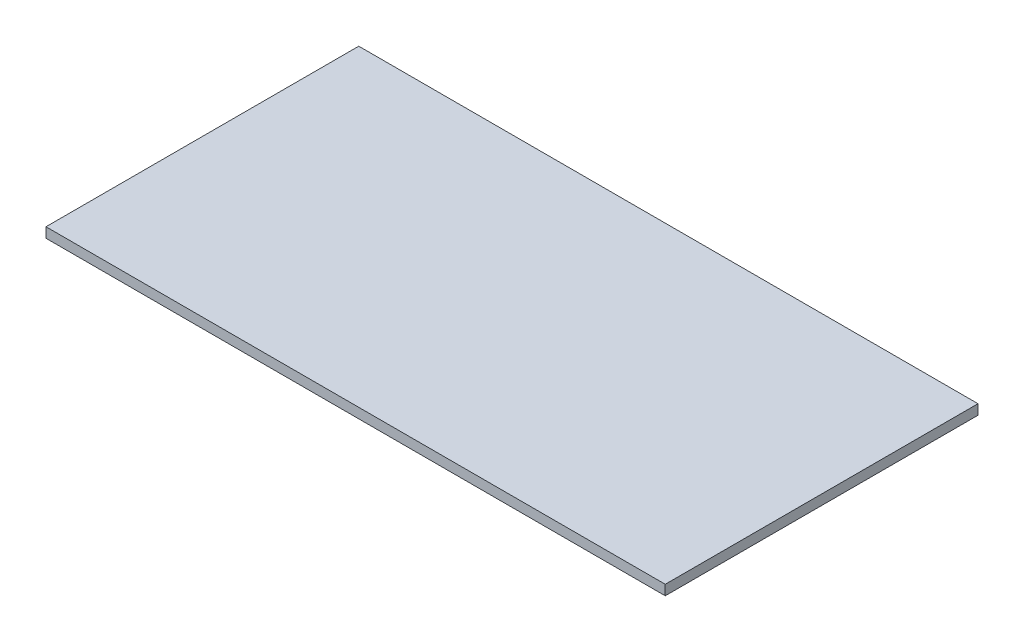
ISO-10303-21;
HEADER;
FILE_DESCRIPTION(('STEP AP214'),'2;1');
FILE_NAME('part.step','',(''),(''),'','','');
FILE_SCHEMA(('AUTOMOTIVE_DESIGN { 1 0 10303 214 1 1 1 1 }'));
ENDSEC;
DATA;
#1=APPLICATION_CONTEXT('core data for automotive mechanical design processes');
#2=APPLICATION_PROTOCOL_DEFINITION('international standard','automotive_design',2000,#1);
#3=PRODUCT_CONTEXT('',#1,'mechanical');
#4=PRODUCT('Part','Part','',(#3));
#5=PRODUCT_RELATED_PRODUCT_CATEGORY('part','',(#4));
#6=PRODUCT_DEFINITION_FORMATION('','',#4);
#7=PRODUCT_DEFINITION_CONTEXT('part definition',#1,'design');
#8=PRODUCT_DEFINITION('design','',#6,#7);
#9=PRODUCT_DEFINITION_SHAPE('','',#8);
#10=(LENGTH_UNIT() NAMED_UNIT(*) SI_UNIT(.MILLI.,.METRE.));
#11=(NAMED_UNIT(*) PLANE_ANGLE_UNIT() SI_UNIT($,.RADIAN.));
#12=(NAMED_UNIT(*) SI_UNIT($,.STERADIAN.) SOLID_ANGLE_UNIT());
#13=UNCERTAINTY_MEASURE_WITH_UNIT(LENGTH_MEASURE(1.E-05),#10,'distance_accuracy_value','');
#14=(GEOMETRIC_REPRESENTATION_CONTEXT(3) GLOBAL_UNCERTAINTY_ASSIGNED_CONTEXT((#13)) GLOBAL_UNIT_ASSIGNED_CONTEXT((#10,
#11,#12)) REPRESENTATION_CONTEXT('',''));
#15=CARTESIAN_POINT('',(0.,0.,0.));
#16=DIRECTION('',(0.,0.,1.));
#17=DIRECTION('',(1.,0.,0.));
#18=AXIS2_PLACEMENT_3D('',#15,#16,#17);
#19=CARTESIAN_POINT('',(-53.0588235294118,1.6,-16.9852941176471));
#20=DIRECTION('',(1.,0.,0.));
#21=DIRECTION('',(0.,0.,-1.));
#22=AXIS2_PLACEMENT_3D('',#19,#20,#21);
#23=PLANE('',#22);
#24=DIRECTION('',(0.,0.,1.));
#25=VECTOR('',#24,1.);
#26=CARTESIAN_POINT('',(-53.0588235294118,0.,-16.9852941176471));
#27=LINE('',#26,#25);
#28=CARTESIAN_POINT('',(-53.0588235294118,0.,-16.9852941176471));
#29=VERTEX_POINT('',#28);
#30=CARTESIAN_POINT('',(-53.0588235294118,0.,33.0147058823529));
#31=VERTEX_POINT('',#30);
#32=EDGE_CURVE('E107',#29,#31,#27,.T.);
#33=ORIENTED_EDGE('',*,*,#32,.T.);
#34=DIRECTION('',(0.,-1.,0.));
#35=VECTOR('',#34,1.);
#36=CARTESIAN_POINT('',(-53.0588235294118,1.6,33.0147058823529));
#37=LINE('',#36,#35);
#38=CARTESIAN_POINT('',(-53.0588235294118,1.6,33.0147058823529));
#39=VERTEX_POINT('',#38);
#40=EDGE_CURVE('E11',#39,#31,#37,.T.);
#41=ORIENTED_EDGE('',*,*,#40,.F.);
#42=DIRECTION('',(0.,0.,1.));
#43=VECTOR('',#42,1.);
#44=CARTESIAN_POINT('',(-53.0588235294118,1.6,-16.9852941176471));
#45=LINE('',#44,#43);
#46=CARTESIAN_POINT('',(-53.0588235294118,1.6,-16.9852941176471));
#47=VERTEX_POINT('',#46);
#48=EDGE_CURVE('E91',#47,#39,#45,.T.);
#49=ORIENTED_EDGE('',*,*,#48,.F.);
#50=DIRECTION('',(0.,-1.,0.));
#51=VECTOR('',#50,1.);
#52=CARTESIAN_POINT('',(-53.0588235294118,1.6,-16.9852941176471));
#53=LINE('',#52,#51);
#54=EDGE_CURVE('E103',#47,#29,#53,.T.);
#55=ORIENTED_EDGE('',*,*,#54,.T.);
#56=EDGE_LOOP('',(#33,#41,#49,#55));
#57=FACE_BOUND('',#56,.T.);
#58=ADVANCED_FACE('F39',(#57),#23,.F.);
#59=CARTESIAN_POINT('',(-53.0588235294118,1.6,33.0147058823529));
#60=DIRECTION('',(0.,0.,-1.));
#61=DIRECTION('',(-1.,0.,0.));
#62=AXIS2_PLACEMENT_3D('',#59,#60,#61);
#63=PLANE('',#62);
#64=DIRECTION('',(1.,0.,0.));
#65=VECTOR('',#64,1.);
#66=CARTESIAN_POINT('',(-53.0588235294118,0.,33.0147058823529));
#67=LINE('',#66,#65);
#68=CARTESIAN_POINT('',(45.9411764705882,0.,33.0147058823529));
#69=VERTEX_POINT('',#68);
#70=EDGE_CURVE('E96',#31,#69,#67,.T.);
#71=ORIENTED_EDGE('',*,*,#70,.T.);
#72=DIRECTION('',(0.,-1.,0.));
#73=VECTOR('',#72,1.);
#74=CARTESIAN_POINT('',(45.9411764705882,1.6,33.0147058823529));
#75=LINE('',#74,#73);
#76=CARTESIAN_POINT('',(45.9411764705882,1.6,33.0147058823529));
#77=VERTEX_POINT('',#76);
#78=EDGE_CURVE('E48',#77,#69,#75,.T.);
#79=ORIENTED_EDGE('',*,*,#78,.F.);
#80=DIRECTION('',(1.,0.,0.));
#81=VECTOR('',#80,1.);
#82=CARTESIAN_POINT('',(-53.0588235294118,1.6,33.0147058823529));
#83=LINE('',#82,#81);
#84=EDGE_CURVE('E86',#39,#77,#83,.T.);
#85=ORIENTED_EDGE('',*,*,#84,.F.);
#86=ORIENTED_EDGE('',*,*,#40,.T.);
#87=EDGE_LOOP('',(#71,#79,#85,#86));
#88=FACE_BOUND('',#87,.T.);
#89=ADVANCED_FACE('F95',(#88),#63,.F.);
#90=CARTESIAN_POINT('',(45.9411764705882,1.6,-16.9852941176471));
#91=DIRECTION('',(-1.,0.,0.));
#92=DIRECTION('',(0.,0.,1.));
#93=AXIS2_PLACEMENT_3D('',#90,#91,#92);
#94=PLANE('',#93);
#95=DIRECTION('',(0.,0.,-1.));
#96=VECTOR('',#95,1.);
#97=CARTESIAN_POINT('',(45.9411764705882,0.,-16.9852941176471));
#98=LINE('',#97,#96);
#99=CARTESIAN_POINT('',(45.9411764705882,0.,-16.9852941176471));
#100=VERTEX_POINT('',#99);
#101=EDGE_CURVE('E73',#69,#100,#98,.T.);
#102=ORIENTED_EDGE('',*,*,#101,.T.);
#103=DIRECTION('',(0.,-1.,0.));
#104=VECTOR('',#103,1.);
#105=CARTESIAN_POINT('',(45.9411764705882,1.6,-16.9852941176471));
#106=LINE('',#105,#104);
#107=CARTESIAN_POINT('',(45.9411764705882,1.6,-16.9852941176471));
#108=VERTEX_POINT('',#107);
#109=EDGE_CURVE('E98',#108,#100,#106,.T.);
#110=ORIENTED_EDGE('',*,*,#109,.F.);
#111=DIRECTION('',(0.,0.,-1.));
#112=VECTOR('',#111,1.);
#113=CARTESIAN_POINT('',(45.9411764705882,1.6,-16.9852941176471));
#114=LINE('',#113,#112);
#115=EDGE_CURVE('E89',#77,#108,#114,.T.);
#116=ORIENTED_EDGE('',*,*,#115,.F.);
#117=ORIENTED_EDGE('',*,*,#78,.T.);
#118=EDGE_LOOP('',(#102,#110,#116,#117));
#119=FACE_BOUND('',#118,.T.);
#120=ADVANCED_FACE('F99',(#119),#94,.F.);
#121=CARTESIAN_POINT('',(-53.0588235294118,1.6,-16.9852941176471));
#122=DIRECTION('',(0.,0.,1.));
#123=DIRECTION('',(1.,0.,0.));
#124=AXIS2_PLACEMENT_3D('',#121,#122,#123);
#125=PLANE('',#124);
#126=DIRECTION('',(-1.,0.,0.));
#127=VECTOR('',#126,1.);
#128=CARTESIAN_POINT('',(-53.0588235294118,0.,-16.9852941176471));
#129=LINE('',#128,#127);
#130=EDGE_CURVE('E79',#100,#29,#129,.T.);
#131=ORIENTED_EDGE('',*,*,#130,.T.);
#132=ORIENTED_EDGE('',*,*,#54,.F.);
#133=DIRECTION('',(-1.,0.,0.));
#134=VECTOR('',#133,1.);
#135=CARTESIAN_POINT('',(-53.0588235294118,1.6,-16.9852941176471));
#136=LINE('',#135,#134);
#137=EDGE_CURVE('E56',#108,#47,#136,.T.);
#138=ORIENTED_EDGE('',*,*,#137,.F.);
#139=ORIENTED_EDGE('',*,*,#109,.T.);
#140=EDGE_LOOP('',(#131,#132,#138,#139));
#141=FACE_BOUND('',#140,.T.);
#142=ADVANCED_FACE('F120',(#141),#125,.F.);
#143=CARTESIAN_POINT('',(0.,1.6,0.));
#144=DIRECTION('',(0.,1.,0.));
#145=DIRECTION('',(0.,0.,1.));
#146=AXIS2_PLACEMENT_3D('',#143,#144,#145);
#147=PLANE('',#146);
#148=ORIENTED_EDGE('',*,*,#48,.T.);
#149=ORIENTED_EDGE('',*,*,#84,.T.);
#150=ORIENTED_EDGE('',*,*,#115,.T.);
#151=ORIENTED_EDGE('',*,*,#137,.T.);
#152=EDGE_LOOP('',(#148,#149,#150,#151));
#153=FACE_BOUND('',#152,.T.);
#154=ADVANCED_FACE('F87',(#153),#147,.T.);
#155=CARTESIAN_POINT('',(0.,0.,0.));
#156=DIRECTION('',(0.,1.,0.));
#157=DIRECTION('',(0.,0.,1.));
#158=AXIS2_PLACEMENT_3D('',#155,#156,#157);
#159=PLANE('',#158);
#160=ORIENTED_EDGE('',*,*,#32,.F.);
#161=ORIENTED_EDGE('',*,*,#130,.F.);
#162=ORIENTED_EDGE('',*,*,#101,.F.);
#163=ORIENTED_EDGE('',*,*,#70,.F.);
#164=EDGE_LOOP('',(#160,#161,#162,#163));
#165=FACE_BOUND('',#164,.T.);
#166=ADVANCED_FACE('F123',(#165),#159,.F.);
#167=CLOSED_SHELL('',(#58,#89,#120,#142,#154,#166));
#168=MANIFOLD_SOLID_BREP('B2',#167);
#169=ADVANCED_BREP_SHAPE_REPRESENTATION('',(#18,#168),#14);
#170=SHAPE_DEFINITION_REPRESENTATION(#9,#169);
ENDSEC;
END-ISO-10303-21;
